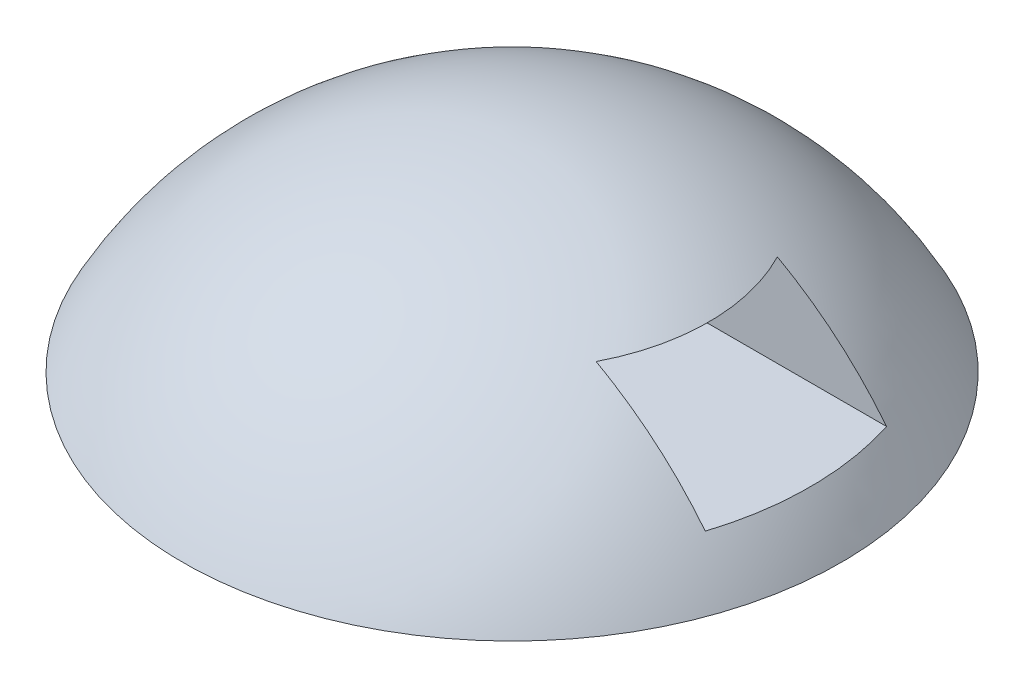
ISO-10303-21;
HEADER;
FILE_DESCRIPTION(('STEP AP214'),'2;1');
FILE_NAME('part.step','',(''),(''),'','','');
FILE_SCHEMA(('AUTOMOTIVE_DESIGN { 1 0 10303 214 1 1 1 1 }'));
ENDSEC;
DATA;
#1=APPLICATION_CONTEXT('core data for automotive mechanical design processes');
#2=APPLICATION_PROTOCOL_DEFINITION('international standard','automotive_design',2000,#1);
#3=PRODUCT_CONTEXT('',#1,'mechanical');
#4=PRODUCT('Part','Part','',(#3));
#5=PRODUCT_RELATED_PRODUCT_CATEGORY('part','',(#4));
#6=PRODUCT_DEFINITION_FORMATION('','',#4);
#7=PRODUCT_DEFINITION_CONTEXT('part definition',#1,'design');
#8=PRODUCT_DEFINITION('design','',#6,#7);
#9=PRODUCT_DEFINITION_SHAPE('','',#8);
#10=(LENGTH_UNIT() NAMED_UNIT(*) SI_UNIT(.MILLI.,.METRE.));
#11=(NAMED_UNIT(*) PLANE_ANGLE_UNIT() SI_UNIT($,.RADIAN.));
#12=(NAMED_UNIT(*) SI_UNIT($,.STERADIAN.) SOLID_ANGLE_UNIT());
#13=UNCERTAINTY_MEASURE_WITH_UNIT(LENGTH_MEASURE(1.E-05),#10,'distance_accuracy_value','');
#14=(GEOMETRIC_REPRESENTATION_CONTEXT(3) GLOBAL_UNCERTAINTY_ASSIGNED_CONTEXT((#13)) GLOBAL_UNIT_ASSIGNED_CONTEXT((#10,
#11,#12)) REPRESENTATION_CONTEXT('',''));
#15=CARTESIAN_POINT('',(0.,0.,0.));
#16=DIRECTION('',(0.,0.,1.));
#17=DIRECTION('',(1.,0.,0.));
#18=AXIS2_PLACEMENT_3D('',#15,#16,#17);
#19=CARTESIAN_POINT('',(-5.,1.5,2.75));
#20=DIRECTION('',(0.,-1.,0.));
#21=DIRECTION('',(0.,0.,-1.));
#22=AXIS2_PLACEMENT_3D('',#19,#20,#21);
#23=PLANE('',#22);
#24=CARTESIAN_POINT('',(0.,1.5,0.));
#25=DIRECTION('',(0.,-1.,0.));
#26=DIRECTION('',(0.,0.,-1.));
#27=AXIS2_PLACEMENT_3D('',#24,#25,#26);
#28=CIRCLE('',#27,1.6);
#29=CARTESIAN_POINT('',(0.,1.5,-1.6));
#30=VERTEX_POINT('',#29);
#31=EDGE_CURVE('E119',#30,#30,#28,.T.);
#32=ORIENTED_EDGE('',*,*,#31,.T.);
#33=EDGE_LOOP('',(#32));
#34=FACE_BOUND('',#33,.T.);
#35=DIRECTION('',(1.,0.,0.));
#36=VECTOR('',#35,1.);
#37=CARTESIAN_POINT('',(-5.,1.5,-2.75));
#38=LINE('',#37,#36);
#39=CARTESIAN_POINT('',(-1.81865334794732,1.5,-2.75));
#40=VERTEX_POINT('',#39);
#41=CARTESIAN_POINT('',(8.61321658847611,1.5,-2.75));
#42=VERTEX_POINT('',#41);
#43=EDGE_CURVE('E117',#40,#42,#38,.T.);
#44=ORIENTED_EDGE('',*,*,#43,.F.);
#45=DIRECTION('',(-0.5,0.,0.866025403784439));
#46=VECTOR('',#45,1.);
#47=CARTESIAN_POINT('',(-4.9955598713677,1.5,2.75256350946109));
#48=LINE('',#47,#46);
#49=CARTESIAN_POINT('',(-3.40636658821879,1.50000000000001,0.));
#50=VERTEX_POINT('',#49);
#51=EDGE_CURVE('E156',#40,#50,#48,.T.);
#52=ORIENTED_EDGE('',*,*,#51,.T.);
#53=DIRECTION('',(0.5,0.,0.866025403784439));
#54=VECTOR('',#53,1.);
#55=CARTESIAN_POINT('',(-2.61399001096049,1.5,1.3724364905389));
#56=LINE('',#55,#54);
#57=CARTESIAN_POINT('',(-1.81865334794732,1.5,2.75));
#58=VERTEX_POINT('',#57);
#59=EDGE_CURVE('E107',#50,#58,#56,.T.);
#60=ORIENTED_EDGE('',*,*,#59,.T.);
#61=DIRECTION('',(1.,0.,0.));
#62=VECTOR('',#61,1.);
#63=CARTESIAN_POINT('',(-5.,1.5,2.75));
#64=LINE('',#63,#62);
#65=CARTESIAN_POINT('',(8.61321658847611,1.5,2.75));
#66=VERTEX_POINT('',#65);
#67=EDGE_CURVE('E105',#58,#66,#64,.T.);
#68=ORIENTED_EDGE('',*,*,#67,.T.);
#69=CARTESIAN_POINT('',(0.,1.5,0.));
#70=DIRECTION('',(0.,-1.,0.));
#71=DIRECTION('',(0.,0.,-1.));
#72=AXIS2_PLACEMENT_3D('',#69,#70,#71);
#73=CIRCLE('',#72,9.04157066001256);
#74=EDGE_CURVE('E54',#66,#42,#73,.F.);
#75=ORIENTED_EDGE('',*,*,#74,.T.);
#76=EDGE_LOOP('',(#44,#52,#60,#68,#75));
#77=FACE_BOUND('',#76,.T.);
#78=ADVANCED_FACE('F45',(#34,#77),#23,.F.);
#79=CARTESIAN_POINT('',(-5.,4.3,2.75));
#80=DIRECTION('',(0.,1.,0.));
#81=DIRECTION('',(0.,0.,1.));
#82=AXIS2_PLACEMENT_3D('',#79,#80,#81);
#83=PLANE('',#82);
#84=DIRECTION('',(0.5,0.,0.866025403784439));
#85=VECTOR('',#84,1.);
#86=CARTESIAN_POINT('',(-2.55477494116409,4.3,1.475));
#87=LINE('',#86,#85);
#88=CARTESIAN_POINT('',(-3.40636658821879,4.3,0.));
#89=VERTEX_POINT('',#88);
#90=CARTESIAN_POINT('',(-1.81865334794732,4.3,2.75));
#91=VERTEX_POINT('',#90);
#92=EDGE_CURVE('E92',#89,#91,#87,.T.);
#93=ORIENTED_EDGE('',*,*,#92,.F.);
#94=DIRECTION('',(-0.5,0.,0.866025403784439));
#95=VECTOR('',#94,1.);
#96=CARTESIAN_POINT('',(-2.5547749411641,4.3,-1.475));
#97=LINE('',#96,#95);
#98=CARTESIAN_POINT('',(-1.81865334794732,4.3,-2.75));
#99=VERTEX_POINT('',#98);
#100=EDGE_CURVE('E163',#99,#89,#97,.T.);
#101=ORIENTED_EDGE('',*,*,#100,.F.);
#102=DIRECTION('',(1.,0.,0.));
#103=VECTOR('',#102,1.);
#104=CARTESIAN_POINT('',(-5.,4.3,-2.75));
#105=LINE('',#104,#103);
#106=CARTESIAN_POINT('',(5.29913514956293,4.3,-2.75));
#107=VERTEX_POINT('',#106);
#108=EDGE_CURVE('E69',#99,#107,#105,.T.);
#109=ORIENTED_EDGE('',*,*,#108,.T.);
#110=CARTESIAN_POINT('',(0.,4.3,0.));
#111=DIRECTION('',(0.,1.,0.));
#112=DIRECTION('',(0.,0.,1.));
#113=AXIS2_PLACEMENT_3D('',#110,#111,#112);
#114=CIRCLE('',#113,5.97020379328322);
#115=CARTESIAN_POINT('',(5.29913514956293,4.3,2.75));
#116=VERTEX_POINT('',#115);
#117=EDGE_CURVE('E111',#107,#116,#114,.F.);
#118=ORIENTED_EDGE('',*,*,#117,.T.);
#119=DIRECTION('',(1.,0.,0.));
#120=VECTOR('',#119,1.);
#121=CARTESIAN_POINT('',(-5.,4.3,2.75));
#122=LINE('',#121,#120);
#123=EDGE_CURVE('E104',#91,#116,#122,.T.);
#124=ORIENTED_EDGE('',*,*,#123,.F.);
#125=EDGE_LOOP('',(#93,#101,#109,#118,#124));
#126=FACE_BOUND('',#125,.T.);
#127=ADVANCED_FACE('F109',(#126),#83,.F.);
#128=CARTESIAN_POINT('',(0.,0.,0.));
#129=DIRECTION('',(0.,-1.,0.));
#130=DIRECTION('',(0.,0.,-1.));
#131=AXIS2_PLACEMENT_3D('',#128,#129,#130);
#132=PLANE('',#131);
#133=CARTESIAN_POINT('',(0.,0.,0.));
#134=DIRECTION('',(0.,-1.,0.));
#135=DIRECTION('',(0.,0.,-1.));
#136=AXIS2_PLACEMENT_3D('',#133,#134,#135);
#137=CIRCLE('',#136,1.6);
#138=CARTESIAN_POINT('',(0.,0.,-1.6));
#139=VERTEX_POINT('',#138);
#140=EDGE_CURVE('E150',#139,#139,#137,.T.);
#141=ORIENTED_EDGE('',*,*,#140,.F.);
#142=EDGE_LOOP('',(#141));
#143=FACE_BOUND('',#142,.T.);
#144=CARTESIAN_POINT('',(0.,0.,0.));
#145=DIRECTION('',(0.,-1.,0.));
#146=DIRECTION('',(0.,0.,-1.));
#147=AXIS2_PLACEMENT_3D('',#144,#145,#146);
#148=CIRCLE('',#147,10.);
#149=CARTESIAN_POINT('',(0.,0.,-10.));
#150=VERTEX_POINT('',#149);
#151=EDGE_CURVE('E123',#150,#150,#148,.T.);
#152=ORIENTED_EDGE('',*,*,#151,.T.);
#153=EDGE_LOOP('',(#152));
#154=FACE_BOUND('',#153,.T.);
#155=ADVANCED_FACE('F47',(#143,#154),#132,.T.);
#156=CARTESIAN_POINT('',(0.,-5.33333333333334,0.));
#157=DIRECTION('',(0.,-1.,0.));
#158=DIRECTION('',(0.,0.,-1.));
#159=AXIS2_PLACEMENT_3D('',#156,#157,#158);
#160=SPHERICAL_SURFACE('',#159,11.3333333333333);
#161=ORIENTED_EDGE('',*,*,#117,.F.);
#162=CARTESIAN_POINT('',(0.,-5.33333333333334,-2.75));
#163=DIRECTION('',(0.,0.,-1.));
#164=DIRECTION('',(0.,1.,0.));
#165=AXIS2_PLACEMENT_3D('',#162,#163,#164);
#166=CIRCLE('',#165,10.9946325288499);
#167=EDGE_CURVE('E11',#42,#107,#166,.F.);
#168=ORIENTED_EDGE('',*,*,#167,.F.);
#169=ORIENTED_EDGE('',*,*,#74,.F.);
#170=CARTESIAN_POINT('',(0.,-5.33333333333334,2.75));
#171=DIRECTION('',(0.,0.,1.));
#172=DIRECTION('',(0.,-1.,0.));
#173=AXIS2_PLACEMENT_3D('',#170,#171,#172);
#174=CIRCLE('',#173,10.9946325288499);
#175=EDGE_CURVE('E129',#116,#66,#174,.F.);
#176=ORIENTED_EDGE('',*,*,#175,.F.);
#177=EDGE_LOOP('',(#161,#168,#169,#176));
#178=FACE_BOUND('',#177,.T.);
#179=ORIENTED_EDGE('',*,*,#151,.F.);
#180=EDGE_LOOP('',(#179));
#181=FACE_BOUND('',#180,.T.);
#182=ADVANCED_FACE('F139',(#178,#181),#160,.T.);
#183=CARTESIAN_POINT('',(-5.,4.3,-2.75));
#184=DIRECTION('',(0.,0.,-1.));
#185=DIRECTION('',(0.,1.,0.));
#186=AXIS2_PLACEMENT_3D('',#183,#184,#185);
#187=PLANE('',#186);
#188=ORIENTED_EDGE('',*,*,#108,.F.);
#189=DIRECTION('',(0.,-1.,0.));
#190=VECTOR('',#189,1.);
#191=CARTESIAN_POINT('',(-1.81865334794732,4.3,-2.75));
#192=LINE('',#191,#190);
#193=EDGE_CURVE('E144',#99,#40,#192,.T.);
#194=ORIENTED_EDGE('',*,*,#193,.T.);
#195=ORIENTED_EDGE('',*,*,#43,.T.);
#196=ORIENTED_EDGE('',*,*,#167,.T.);
#197=EDGE_LOOP('',(#188,#194,#195,#196));
#198=FACE_BOUND('',#197,.T.);
#199=ADVANCED_FACE('F142',(#198),#187,.F.);
#200=CARTESIAN_POINT('',(-5.,4.3,2.75));
#201=DIRECTION('',(0.,0.,1.));
#202=DIRECTION('',(0.,-1.,0.));
#203=AXIS2_PLACEMENT_3D('',#200,#201,#202);
#204=PLANE('',#203);
#205=ORIENTED_EDGE('',*,*,#67,.F.);
#206=DIRECTION('',(0.,1.,0.));
#207=VECTOR('',#206,1.);
#208=CARTESIAN_POINT('',(-1.81865334794732,4.3,2.75));
#209=LINE('',#208,#207);
#210=EDGE_CURVE('E95',#58,#91,#209,.T.);
#211=ORIENTED_EDGE('',*,*,#210,.T.);
#212=ORIENTED_EDGE('',*,*,#123,.T.);
#213=ORIENTED_EDGE('',*,*,#175,.T.);
#214=EDGE_LOOP('',(#205,#211,#212,#213));
#215=FACE_BOUND('',#214,.T.);
#216=ADVANCED_FACE('F102',(#215),#204,.F.);
#217=CARTESIAN_POINT('',(0.,0.,0.));
#218=DIRECTION('',(0.,-1.,0.));
#219=DIRECTION('',(0.,0.,-1.));
#220=AXIS2_PLACEMENT_3D('',#217,#218,#219);
#221=CYLINDRICAL_SURFACE('',#220,1.6);
#222=ORIENTED_EDGE('',*,*,#31,.F.);
#223=EDGE_LOOP('',(#222));
#224=FACE_BOUND('',#223,.T.);
#225=ORIENTED_EDGE('',*,*,#140,.T.);
#226=EDGE_LOOP('',(#225));
#227=FACE_BOUND('',#226,.T.);
#228=ADVANCED_FACE('F168',(#224,#227),#221,.F.);
#229=CARTESIAN_POINT('',(-2.5547749411641,20.7186276388157,-1.475));
#230=DIRECTION('',(0.866025403784439,0.,0.5));
#231=DIRECTION('',(0.5,0.,-0.866025403784439));
#232=AXIS2_PLACEMENT_3D('',#229,#230,#231);
#233=PLANE('',#232);
#234=ORIENTED_EDGE('',*,*,#193,.F.);
#235=ORIENTED_EDGE('',*,*,#100,.T.);
#236=DIRECTION('',(0.,-1.,0.));
#237=VECTOR('',#236,1.);
#238=CARTESIAN_POINT('',(-3.40636658821879,20.7186276388157,0.));
#239=LINE('',#238,#237);
#240=EDGE_CURVE('E61',#89,#50,#239,.T.);
#241=ORIENTED_EDGE('',*,*,#240,.T.);
#242=ORIENTED_EDGE('',*,*,#51,.F.);
#243=EDGE_LOOP('',(#234,#235,#241,#242));
#244=FACE_BOUND('',#243,.T.);
#245=ADVANCED_FACE('F166',(#244),#233,.T.);
#246=CARTESIAN_POINT('',(-2.55477494116409,20.7186276388157,1.475));
#247=DIRECTION('',(0.866025403784438,0.,-0.5));
#248=DIRECTION('',(-0.5,0.,-0.866025403784439));
#249=AXIS2_PLACEMENT_3D('',#246,#247,#248);
#250=PLANE('',#249);
#251=ORIENTED_EDGE('',*,*,#59,.F.);
#252=ORIENTED_EDGE('',*,*,#240,.F.);
#253=ORIENTED_EDGE('',*,*,#92,.T.);
#254=ORIENTED_EDGE('',*,*,#210,.F.);
#255=EDGE_LOOP('',(#251,#252,#253,#254));
#256=FACE_BOUND('',#255,.T.);
#257=ADVANCED_FACE('F94',(#256),#250,.T.);
#258=CLOSED_SHELL('',(#78,#127,#155,#182,#199,#216,#228,#245,#257));
#259=MANIFOLD_SOLID_BREP('B2',#258);
#260=ADVANCED_BREP_SHAPE_REPRESENTATION('',(#18,#259),#14);
#261=SHAPE_DEFINITION_REPRESENTATION(#9,#260);
ENDSEC;
END-ISO-10303-21;
